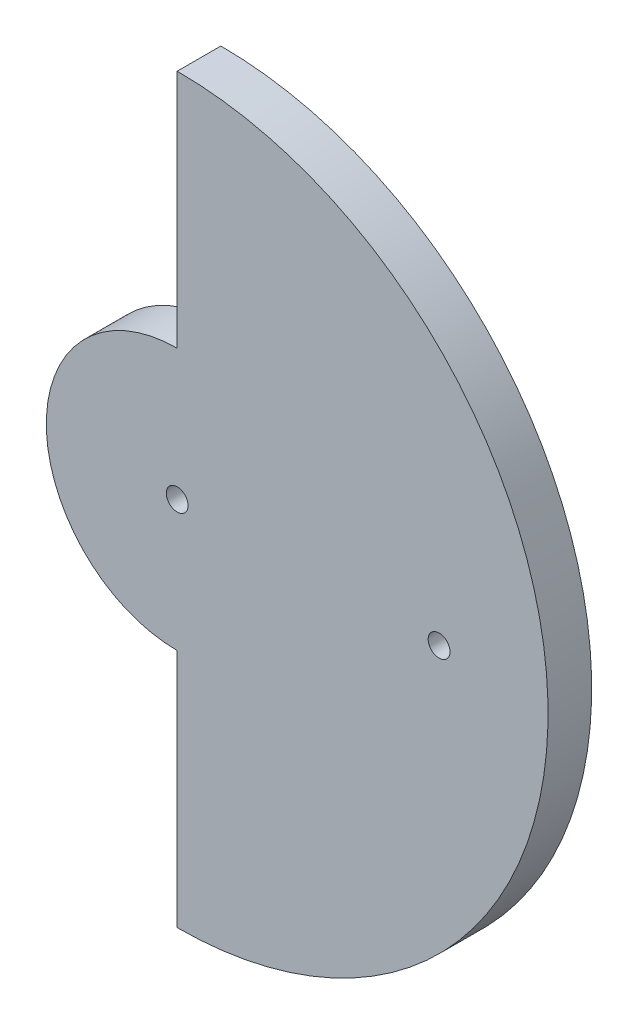
ISO-10303-21;
HEADER;
FILE_DESCRIPTION(('STEP AP214'),'2;1');
FILE_NAME('part.step','',(''),(''),'','','');
FILE_SCHEMA(('AUTOMOTIVE_DESIGN { 1 0 10303 214 1 1 1 1 }'));
ENDSEC;
DATA;
#1=APPLICATION_CONTEXT('core data for automotive mechanical design processes');
#2=APPLICATION_PROTOCOL_DEFINITION('international standard','automotive_design',2000,#1);
#3=PRODUCT_CONTEXT('',#1,'mechanical');
#4=PRODUCT('Part','Part','',(#3));
#5=PRODUCT_RELATED_PRODUCT_CATEGORY('part','',(#4));
#6=PRODUCT_DEFINITION_FORMATION('','',#4);
#7=PRODUCT_DEFINITION_CONTEXT('part definition',#1,'design');
#8=PRODUCT_DEFINITION('design','',#6,#7);
#9=PRODUCT_DEFINITION_SHAPE('','',#8);
#10=(LENGTH_UNIT() NAMED_UNIT(*) SI_UNIT(.MILLI.,.METRE.));
#11=(NAMED_UNIT(*) PLANE_ANGLE_UNIT() SI_UNIT($,.RADIAN.));
#12=(NAMED_UNIT(*) SI_UNIT($,.STERADIAN.) SOLID_ANGLE_UNIT());
#13=UNCERTAINTY_MEASURE_WITH_UNIT(LENGTH_MEASURE(1.E-05),#10,'distance_accuracy_value','');
#14=(GEOMETRIC_REPRESENTATION_CONTEXT(3) GLOBAL_UNCERTAINTY_ASSIGNED_CONTEXT((#13)) GLOBAL_UNIT_ASSIGNED_CONTEXT((#10,
#11,#12)) REPRESENTATION_CONTEXT('',''));
#15=CARTESIAN_POINT('',(0.,0.,0.));
#16=DIRECTION('',(0.,0.,1.));
#17=DIRECTION('',(1.,0.,0.));
#18=AXIS2_PLACEMENT_3D('',#15,#16,#17);
#19=CARTESIAN_POINT('',(0.,0.,10.));
#20=DIRECTION('',(0.,0.,-1.));
#21=DIRECTION('',(-1.,0.,0.));
#22=AXIS2_PLACEMENT_3D('',#19,#20,#21);
#23=CYLINDRICAL_SURFACE('',#22,85.);
#24=CARTESIAN_POINT('',(0.,0.,0.));
#25=DIRECTION('',(0.,0.,1.));
#26=DIRECTION('',(1.,0.,0.));
#27=AXIS2_PLACEMENT_3D('',#24,#25,#26);
#28=CIRCLE('',#27,85.);
#29=CARTESIAN_POINT('',(0.,-85.,0.));
#30=VERTEX_POINT('',#29);
#31=CARTESIAN_POINT('',(0.,85.,0.));
#32=VERTEX_POINT('',#31);
#33=EDGE_CURVE('E42',#30,#32,#28,.T.);
#34=ORIENTED_EDGE('',*,*,#33,.T.);
#35=DIRECTION('',(0.,0.,-1.));
#36=VECTOR('',#35,1.);
#37=CARTESIAN_POINT('',(0.,85.,10.));
#38=LINE('',#37,#36);
#39=CARTESIAN_POINT('',(0.,85.,10.));
#40=VERTEX_POINT('',#39);
#41=EDGE_CURVE('E91',#40,#32,#38,.T.);
#42=ORIENTED_EDGE('',*,*,#41,.F.);
#43=CARTESIAN_POINT('',(0.,0.,10.));
#44=DIRECTION('',(0.,0.,1.));
#45=DIRECTION('',(1.,0.,0.));
#46=AXIS2_PLACEMENT_3D('',#43,#44,#45);
#47=CIRCLE('',#46,85.);
#48=CARTESIAN_POINT('',(0.,-85.,10.));
#49=VERTEX_POINT('',#48);
#50=EDGE_CURVE('E11',#49,#40,#47,.T.);
#51=ORIENTED_EDGE('',*,*,#50,.F.);
#52=DIRECTION('',(0.,0.,-1.));
#53=VECTOR('',#52,1.);
#54=CARTESIAN_POINT('',(0.,-85.,10.));
#55=LINE('',#54,#53);
#56=EDGE_CURVE('E81',#49,#30,#55,.T.);
#57=ORIENTED_EDGE('',*,*,#56,.T.);
#58=EDGE_LOOP('',(#34,#42,#51,#57));
#59=FACE_BOUND('',#58,.T.);
#60=ADVANCED_FACE('F39',(#59),#23,.T.);
#61=CARTESIAN_POINT('',(0.,0.,10.));
#62=DIRECTION('',(0.,0.,1.));
#63=DIRECTION('',(1.,0.,0.));
#64=AXIS2_PLACEMENT_3D('',#61,#62,#63);
#65=PLANE('',#64);
#66=DIRECTION('',(0.,-1.,0.));
#67=VECTOR('',#66,1.);
#68=CARTESIAN_POINT('',(0.,0.,10.));
#69=LINE('',#68,#67);
#70=CARTESIAN_POINT('',(0.,30.,10.));
#71=VERTEX_POINT('',#70);
#72=EDGE_CURVE('E97',#40,#71,#69,.T.);
#73=ORIENTED_EDGE('',*,*,#72,.T.);
#74=CARTESIAN_POINT('',(0.,0.,10.));
#75=DIRECTION('',(0.,0.,-1.));
#76=DIRECTION('',(-1.,0.,0.));
#77=AXIS2_PLACEMENT_3D('',#74,#75,#76);
#78=CIRCLE('',#77,30.);
#79=CARTESIAN_POINT('',(0.,-30.,10.));
#80=VERTEX_POINT('',#79);
#81=EDGE_CURVE('E59',#80,#71,#78,.T.);
#82=ORIENTED_EDGE('',*,*,#81,.F.);
#83=EDGE_CURVE('E84',#80,#49,#69,.T.);
#84=ORIENTED_EDGE('',*,*,#83,.T.);
#85=ORIENTED_EDGE('',*,*,#50,.T.);
#86=EDGE_LOOP('',(#73,#82,#84,#85));
#87=FACE_BOUND('',#86,.T.);
#88=CARTESIAN_POINT('',(60.0254850805423,1.00933331083486,10.));
#89=DIRECTION('',(0.,0.,-1.));
#90=DIRECTION('',(-1.,0.,0.));
#91=AXIS2_PLACEMENT_3D('',#88,#89,#90);
#92=CIRCLE('',#91,2.5);
#93=CARTESIAN_POINT('',(57.5254850805423,1.00933331083486,10.));
#94=VERTEX_POINT('',#93);
#95=EDGE_CURVE('E108',#94,#94,#92,.T.);
#96=ORIENTED_EDGE('',*,*,#95,.T.);
#97=EDGE_LOOP('',(#96));
#98=FACE_BOUND('',#97,.T.);
#99=CARTESIAN_POINT('',(0.,0.,10.));
#100=DIRECTION('',(0.,0.,1.));
#101=DIRECTION('',(1.,0.,0.));
#102=AXIS2_PLACEMENT_3D('',#99,#100,#101);
#103=CIRCLE('',#102,2.5);
#104=CARTESIAN_POINT('',(2.5,0.,10.));
#105=VERTEX_POINT('',#104);
#106=EDGE_CURVE('E111',#105,#105,#103,.T.);
#107=ORIENTED_EDGE('',*,*,#106,.F.);
#108=EDGE_LOOP('',(#107));
#109=FACE_BOUND('',#108,.T.);
#110=ADVANCED_FACE('F95',(#87,#98,#109),#65,.T.);
#111=CARTESIAN_POINT('',(0.,0.,0.));
#112=DIRECTION('',(0.,0.,1.));
#113=DIRECTION('',(1.,0.,0.));
#114=AXIS2_PLACEMENT_3D('',#111,#112,#113);
#115=PLANE('',#114);
#116=CARTESIAN_POINT('',(60.0254850805423,1.00933331083486,0.));
#117=DIRECTION('',(0.,0.,-1.));
#118=DIRECTION('',(-1.,0.,0.));
#119=AXIS2_PLACEMENT_3D('',#116,#117,#118);
#120=CIRCLE('',#119,2.5);
#121=CARTESIAN_POINT('',(57.5254850805423,1.00933331083486,0.));
#122=VERTEX_POINT('',#121);
#123=EDGE_CURVE('E103',#122,#122,#120,.T.);
#124=ORIENTED_EDGE('',*,*,#123,.F.);
#125=EDGE_LOOP('',(#124));
#126=FACE_BOUND('',#125,.T.);
#127=CARTESIAN_POINT('',(0.,0.,0.));
#128=DIRECTION('',(0.,0.,1.));
#129=DIRECTION('',(1.,0.,0.));
#130=AXIS2_PLACEMENT_3D('',#127,#128,#129);
#131=CIRCLE('',#130,2.5);
#132=CARTESIAN_POINT('',(2.5,0.,0.));
#133=VERTEX_POINT('',#132);
#134=EDGE_CURVE('E114',#133,#133,#131,.T.);
#135=ORIENTED_EDGE('',*,*,#134,.T.);
#136=EDGE_LOOP('',(#135));
#137=FACE_BOUND('',#136,.T.);
#138=CARTESIAN_POINT('',(0.,0.,0.));
#139=DIRECTION('',(0.,0.,-1.));
#140=DIRECTION('',(-1.,0.,0.));
#141=AXIS2_PLACEMENT_3D('',#138,#139,#140);
#142=CIRCLE('',#141,30.);
#143=CARTESIAN_POINT('',(0.,-30.,0.));
#144=VERTEX_POINT('',#143);
#145=CARTESIAN_POINT('',(0.,30.,0.));
#146=VERTEX_POINT('',#145);
#147=EDGE_CURVE('E53',#144,#146,#142,.T.);
#148=ORIENTED_EDGE('',*,*,#147,.T.);
#149=DIRECTION('',(0.,-1.,0.));
#150=VECTOR('',#149,1.);
#151=CARTESIAN_POINT('',(0.,0.,0.));
#152=LINE('',#151,#150);
#153=EDGE_CURVE('E146',#32,#146,#152,.T.);
#154=ORIENTED_EDGE('',*,*,#153,.F.);
#155=ORIENTED_EDGE('',*,*,#33,.F.);
#156=EDGE_CURVE('E86',#144,#30,#152,.T.);
#157=ORIENTED_EDGE('',*,*,#156,.F.);
#158=EDGE_LOOP('',(#148,#154,#155,#157));
#159=FACE_BOUND('',#158,.T.);
#160=ADVANCED_FACE('F123',(#126,#137,#159),#115,.F.);
#161=CARTESIAN_POINT('',(0.,0.,0.));
#162=DIRECTION('',(0.,0.,1.));
#163=DIRECTION('',(1.,0.,0.));
#164=AXIS2_PLACEMENT_3D('',#161,#162,#163);
#165=CYLINDRICAL_SURFACE('',#164,2.5);
#166=ORIENTED_EDGE('',*,*,#134,.F.);
#167=EDGE_LOOP('',(#166));
#168=FACE_BOUND('',#167,.T.);
#169=ORIENTED_EDGE('',*,*,#106,.T.);
#170=EDGE_LOOP('',(#169));
#171=FACE_BOUND('',#170,.T.);
#172=ADVANCED_FACE('F120',(#168,#171),#165,.F.);
#173=CARTESIAN_POINT('',(60.0254850805423,1.00933331083486,10.));
#174=DIRECTION('',(0.,0.,-1.));
#175=DIRECTION('',(-1.,0.,0.));
#176=AXIS2_PLACEMENT_3D('',#173,#174,#175);
#177=CYLINDRICAL_SURFACE('',#176,2.5);
#178=ORIENTED_EDGE('',*,*,#95,.F.);
#179=EDGE_LOOP('',(#178));
#180=FACE_BOUND('',#179,.T.);
#181=ORIENTED_EDGE('',*,*,#123,.T.);
#182=EDGE_LOOP('',(#181));
#183=FACE_BOUND('',#182,.T.);
#184=ADVANCED_FACE('F134',(#180,#183),#177,.F.);
#185=CARTESIAN_POINT('',(0.,0.,10.));
#186=DIRECTION('',(0.,0.,-1.));
#187=DIRECTION('',(-1.,0.,0.));
#188=AXIS2_PLACEMENT_3D('',#185,#186,#187);
#189=CYLINDRICAL_SURFACE('',#188,30.);
#190=ORIENTED_EDGE('',*,*,#147,.F.);
#191=DIRECTION('',(0.,0.,-1.));
#192=VECTOR('',#191,1.);
#193=CARTESIAN_POINT('',(0.,-30.,10.));
#194=LINE('',#193,#192);
#195=EDGE_CURVE('E76',#80,#144,#194,.T.);
#196=ORIENTED_EDGE('',*,*,#195,.F.);
#197=ORIENTED_EDGE('',*,*,#81,.T.);
#198=DIRECTION('',(0.,0.,-1.));
#199=VECTOR('',#198,1.);
#200=CARTESIAN_POINT('',(0.,30.,10.));
#201=LINE('',#200,#199);
#202=EDGE_CURVE('E73',#71,#146,#201,.T.);
#203=ORIENTED_EDGE('',*,*,#202,.T.);
#204=EDGE_LOOP('',(#190,#196,#197,#203));
#205=FACE_BOUND('',#204,.T.);
#206=ADVANCED_FACE('F138',(#205),#189,.T.);
#207=CARTESIAN_POINT('',(0.,0.,10.));
#208=DIRECTION('',(1.,0.,0.));
#209=DIRECTION('',(0.,0.,-1.));
#210=AXIS2_PLACEMENT_3D('',#207,#208,#209);
#211=PLANE('',#210);
#212=ORIENTED_EDGE('',*,*,#153,.T.);
#213=ORIENTED_EDGE('',*,*,#202,.F.);
#214=ORIENTED_EDGE('',*,*,#72,.F.);
#215=ORIENTED_EDGE('',*,*,#41,.T.);
#216=EDGE_LOOP('',(#212,#213,#214,#215));
#217=FACE_BOUND('',#216,.T.);
#218=ADVANCED_FACE('F142',(#217),#211,.F.);
#219=ORIENTED_EDGE('',*,*,#156,.T.);
#220=ORIENTED_EDGE('',*,*,#56,.F.);
#221=ORIENTED_EDGE('',*,*,#83,.F.);
#222=ORIENTED_EDGE('',*,*,#195,.T.);
#223=EDGE_LOOP('',(#219,#220,#221,#222));
#224=FACE_BOUND('',#223,.T.);
#225=ADVANCED_FACE('F83',(#224),#211,.F.);
#226=CLOSED_SHELL('',(#60,#110,#160,#172,#184,#206,#218,#225));
#227=MANIFOLD_SOLID_BREP('B2',#226);
#228=ADVANCED_BREP_SHAPE_REPRESENTATION('',(#18,#227),#14);
#229=SHAPE_DEFINITION_REPRESENTATION(#9,#228);
ENDSEC;
END-ISO-10303-21;
